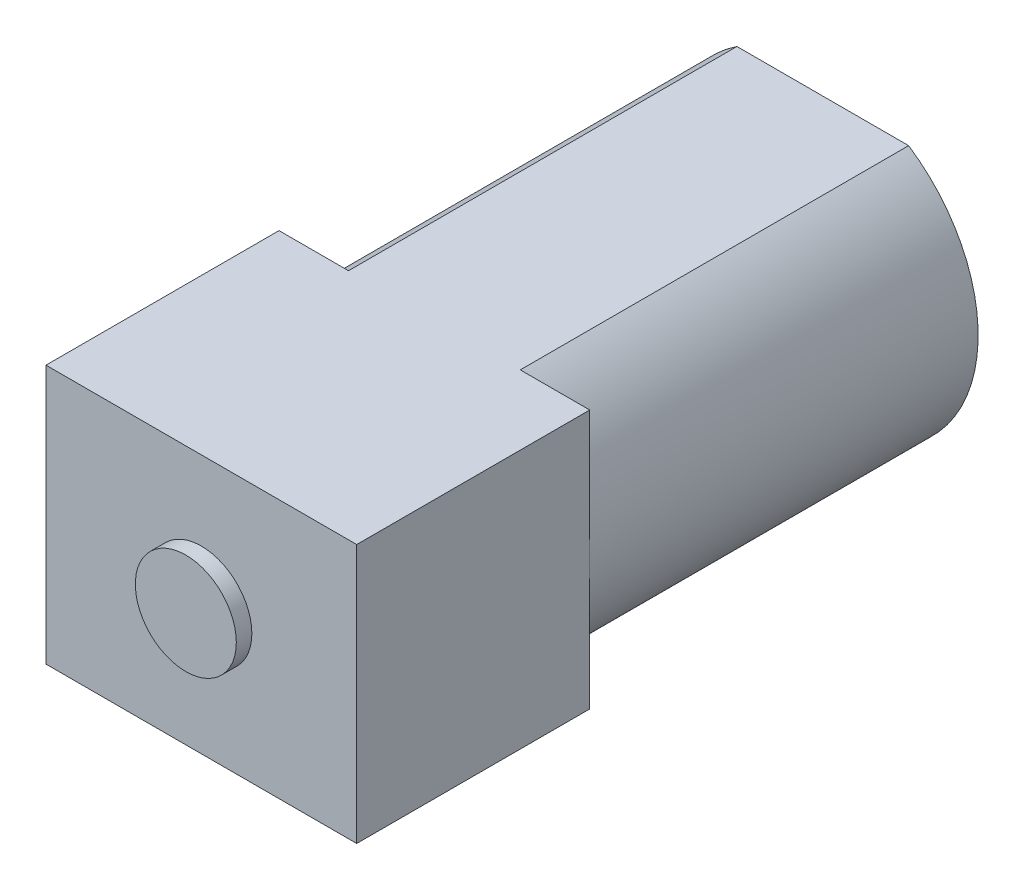
ISO-10303-21;
HEADER;
FILE_DESCRIPTION(('STEP AP214'),'2;1');
FILE_NAME('part.step','',(''),(''),'','','');
FILE_SCHEMA(('AUTOMOTIVE_DESIGN { 1 0 10303 214 1 1 1 1 }'));
ENDSEC;
DATA;
#1=APPLICATION_CONTEXT('core data for automotive mechanical design processes');
#2=APPLICATION_PROTOCOL_DEFINITION('international standard','automotive_design',2000,#1);
#3=PRODUCT_CONTEXT('',#1,'mechanical');
#4=PRODUCT('Part','Part','',(#3));
#5=PRODUCT_RELATED_PRODUCT_CATEGORY('part','',(#4));
#6=PRODUCT_DEFINITION_FORMATION('','',#4);
#7=PRODUCT_DEFINITION_CONTEXT('part definition',#1,'design');
#8=PRODUCT_DEFINITION('design','',#6,#7);
#9=PRODUCT_DEFINITION_SHAPE('','',#8);
#10=(LENGTH_UNIT() NAMED_UNIT(*) SI_UNIT(.MILLI.,.METRE.));
#11=(NAMED_UNIT(*) PLANE_ANGLE_UNIT() SI_UNIT($,.RADIAN.));
#12=(NAMED_UNIT(*) SI_UNIT($,.STERADIAN.) SOLID_ANGLE_UNIT());
#13=UNCERTAINTY_MEASURE_WITH_UNIT(LENGTH_MEASURE(1.E-05),#10,'distance_accuracy_value','');
#14=(GEOMETRIC_REPRESENTATION_CONTEXT(3) GLOBAL_UNCERTAINTY_ASSIGNED_CONTEXT((#13)) GLOBAL_UNIT_ASSIGNED_CONTEXT((#10,
#11,#12)) REPRESENTATION_CONTEXT('',''));
#15=CARTESIAN_POINT('',(0.,0.,0.));
#16=DIRECTION('',(0.,0.,1.));
#17=DIRECTION('',(1.,0.,0.));
#18=AXIS2_PLACEMENT_3D('',#15,#16,#17);
#19=CARTESIAN_POINT('',(-6.,-5.,9.));
#20=DIRECTION('',(0.,0.,1.));
#21=DIRECTION('',(1.,0.,0.));
#22=AXIS2_PLACEMENT_3D('',#19,#20,#21);
#23=PLANE('',#22);
#24=DIRECTION('',(0.,-1.,0.));
#25=VECTOR('',#24,1.);
#26=CARTESIAN_POINT('',(-6.,5.,9.));
#27=LINE('',#26,#25);
#28=CARTESIAN_POINT('',(-6.,5.,9.));
#29=VERTEX_POINT('',#28);
#30=CARTESIAN_POINT('',(-6.,-5.,9.));
#31=VERTEX_POINT('',#30);
#32=EDGE_CURVE('E143',#29,#31,#27,.T.);
#33=ORIENTED_EDGE('',*,*,#32,.T.);
#34=DIRECTION('',(1.,0.,0.));
#35=VECTOR('',#34,1.);
#36=CARTESIAN_POINT('',(-6.,-5.,9.));
#37=LINE('',#36,#35);
#38=CARTESIAN_POINT('',(6.,-5.,9.));
#39=VERTEX_POINT('',#38);
#40=EDGE_CURVE('E149',#31,#39,#37,.T.);
#41=ORIENTED_EDGE('',*,*,#40,.T.);
#42=DIRECTION('',(0.,1.,0.));
#43=VECTOR('',#42,1.);
#44=CARTESIAN_POINT('',(6.,5.,9.));
#45=LINE('',#44,#43);
#46=CARTESIAN_POINT('',(6.,5.,9.));
#47=VERTEX_POINT('',#46);
#48=EDGE_CURVE('E152',#39,#47,#45,.T.);
#49=ORIENTED_EDGE('',*,*,#48,.T.);
#50=DIRECTION('',(-1.,0.,0.));
#51=VECTOR('',#50,1.);
#52=CARTESIAN_POINT('',(-6.,5.,9.));
#53=LINE('',#52,#51);
#54=EDGE_CURVE('E155',#47,#29,#53,.T.);
#55=ORIENTED_EDGE('',*,*,#54,.T.);
#56=EDGE_LOOP('',(#33,#41,#49,#55));
#57=FACE_BOUND('',#56,.T.);
#58=CARTESIAN_POINT('',(0.,0.,9.));
#59=DIRECTION('',(0.,0.,1.));
#60=DIRECTION('',(1.,0.,0.));
#61=AXIS2_PLACEMENT_3D('',#58,#59,#60);
#62=CIRCLE('',#61,1.95);
#63=CARTESIAN_POINT('',(1.95,0.,9.));
#64=VERTEX_POINT('',#63);
#65=EDGE_CURVE('E202',#64,#64,#62,.T.);
#66=ORIENTED_EDGE('',*,*,#65,.F.);
#67=EDGE_LOOP('',(#66));
#68=FACE_BOUND('',#67,.T.);
#69=ADVANCED_FACE('F41',(#57,#68),#23,.T.);
#70=CARTESIAN_POINT('',(-6.,-5.,-15.));
#71=DIRECTION('',(0.,0.,1.));
#72=DIRECTION('',(1.,0.,0.));
#73=AXIS2_PLACEMENT_3D('',#70,#71,#72);
#74=PLANE('',#73);
#75=CARTESIAN_POINT('',(0.,0.,-15.));
#76=DIRECTION('',(0.,0.,1.));
#77=DIRECTION('',(1.,0.,0.));
#78=AXIS2_PLACEMENT_3D('',#75,#76,#77);
#79=CIRCLE('',#78,6.);
#80=CARTESIAN_POINT('',(-3.3166247903554,5.,-15.));
#81=VERTEX_POINT('',#80);
#82=CARTESIAN_POINT('',(-3.3166247903554,-5.,-15.));
#83=VERTEX_POINT('',#82);
#84=EDGE_CURVE('E171',#81,#83,#79,.T.);
#85=ORIENTED_EDGE('',*,*,#84,.F.);
#86=DIRECTION('',(-1.,0.,0.));
#87=VECTOR('',#86,1.);
#88=CARTESIAN_POINT('',(-6.,5.,-15.));
#89=LINE('',#88,#87);
#90=CARTESIAN_POINT('',(3.3166247903554,5.,-15.));
#91=VERTEX_POINT('',#90);
#92=EDGE_CURVE('E160',#91,#81,#89,.T.);
#93=ORIENTED_EDGE('',*,*,#92,.F.);
#94=CARTESIAN_POINT('',(3.3166247903554,-5.,-15.));
#95=VERTEX_POINT('',#94);
#96=EDGE_CURVE('E165',#95,#91,#79,.T.);
#97=ORIENTED_EDGE('',*,*,#96,.F.);
#98=DIRECTION('',(1.,0.,0.));
#99=VECTOR('',#98,1.);
#100=CARTESIAN_POINT('',(-6.,-5.,-15.));
#101=LINE('',#100,#99);
#102=EDGE_CURVE('E157',#83,#95,#101,.T.);
#103=ORIENTED_EDGE('',*,*,#102,.F.);
#104=EDGE_LOOP('',(#85,#93,#97,#103));
#105=FACE_BOUND('',#104,.T.);
#106=CARTESIAN_POINT('',(0.,0.,-15.));
#107=DIRECTION('',(0.,0.,1.));
#108=DIRECTION('',(1.,0.,0.));
#109=AXIS2_PLACEMENT_3D('',#106,#107,#108);
#110=CIRCLE('',#109,2.5);
#111=CARTESIAN_POINT('',(2.5,0.,-15.));
#112=VERTEX_POINT('',#111);
#113=EDGE_CURVE('E12',#112,#112,#110,.F.);
#114=ORIENTED_EDGE('',*,*,#113,.F.);
#115=EDGE_LOOP('',(#114));
#116=FACE_BOUND('',#115,.T.);
#117=ADVANCED_FACE('F182',(#105,#116),#74,.F.);
#118=CARTESIAN_POINT('',(-6.,5.,-15.));
#119=DIRECTION('',(-1.,0.,0.));
#120=DIRECTION('',(0.,-1.,0.));
#121=AXIS2_PLACEMENT_3D('',#118,#119,#120);
#122=PLANE('',#121);
#123=DIRECTION('',(0.,0.,1.));
#124=VECTOR('',#123,1.);
#125=CARTESIAN_POINT('',(-6.,5.,-15.));
#126=LINE('',#125,#124);
#127=CARTESIAN_POINT('',(-6.,5.,0.));
#128=VERTEX_POINT('',#127);
#129=EDGE_CURVE('E64',#128,#29,#126,.T.);
#130=ORIENTED_EDGE('',*,*,#129,.F.);
#131=DIRECTION('',(0.,-1.,0.));
#132=VECTOR('',#131,1.);
#133=CARTESIAN_POINT('',(-6.,5.,0.));
#134=LINE('',#133,#132);
#135=CARTESIAN_POINT('',(-6.,0.,0.));
#136=VERTEX_POINT('',#135);
#137=EDGE_CURVE('E123',#128,#136,#134,.T.);
#138=ORIENTED_EDGE('',*,*,#137,.T.);
#139=CARTESIAN_POINT('',(-6.,-5.,0.));
#140=VERTEX_POINT('',#139);
#141=EDGE_CURVE('E115',#136,#140,#134,.T.);
#142=ORIENTED_EDGE('',*,*,#141,.T.);
#143=DIRECTION('',(0.,0.,1.));
#144=VECTOR('',#143,1.);
#145=CARTESIAN_POINT('',(-6.,-5.,-15.));
#146=LINE('',#145,#144);
#147=EDGE_CURVE('E163',#140,#31,#146,.T.);
#148=ORIENTED_EDGE('',*,*,#147,.T.);
#149=ORIENTED_EDGE('',*,*,#32,.F.);
#150=EDGE_LOOP('',(#130,#138,#142,#148,#149));
#151=FACE_BOUND('',#150,.T.);
#152=ADVANCED_FACE('F43',(#151),#122,.T.);
#153=CARTESIAN_POINT('',(-6.,5.,-15.));
#154=DIRECTION('',(0.,1.,0.));
#155=DIRECTION('',(0.,0.,1.));
#156=AXIS2_PLACEMENT_3D('',#153,#154,#155);
#157=PLANE('',#156);
#158=DIRECTION('',(0.,0.,1.));
#159=VECTOR('',#158,1.);
#160=CARTESIAN_POINT('',(6.,5.,-15.));
#161=LINE('',#160,#159);
#162=CARTESIAN_POINT('',(6.,5.,0.));
#163=VERTEX_POINT('',#162);
#164=EDGE_CURVE('E166',#163,#47,#161,.T.);
#165=ORIENTED_EDGE('',*,*,#164,.F.);
#166=DIRECTION('',(-1.,0.,0.));
#167=VECTOR('',#166,1.);
#168=CARTESIAN_POINT('',(-6.,5.,0.));
#169=LINE('',#168,#167);
#170=CARTESIAN_POINT('',(3.3166247903554,5.,0.));
#171=VERTEX_POINT('',#170);
#172=EDGE_CURVE('E124',#163,#171,#169,.T.);
#173=ORIENTED_EDGE('',*,*,#172,.T.);
#174=DIRECTION('',(0.,0.,-1.));
#175=VECTOR('',#174,1.);
#176=CARTESIAN_POINT('',(3.3166247903554,5.,0.));
#177=LINE('',#176,#175);
#178=EDGE_CURVE('E187',#171,#91,#177,.T.);
#179=ORIENTED_EDGE('',*,*,#178,.T.);
#180=ORIENTED_EDGE('',*,*,#92,.T.);
#181=DIRECTION('',(0.,0.,-1.));
#182=VECTOR('',#181,1.);
#183=CARTESIAN_POINT('',(-3.3166247903554,5.,0.));
#184=LINE('',#183,#182);
#185=CARTESIAN_POINT('',(-3.3166247903554,5.,0.));
#186=VERTEX_POINT('',#185);
#187=EDGE_CURVE('E176',#81,#186,#184,.F.);
#188=ORIENTED_EDGE('',*,*,#187,.T.);
#189=EDGE_CURVE('E140',#186,#128,#169,.T.);
#190=ORIENTED_EDGE('',*,*,#189,.T.);
#191=ORIENTED_EDGE('',*,*,#129,.T.);
#192=ORIENTED_EDGE('',*,*,#54,.F.);
#193=EDGE_LOOP('',(#165,#173,#179,#180,#188,#190,#191,#192));
#194=FACE_BOUND('',#193,.T.);
#195=ADVANCED_FACE('F191',(#194),#157,.T.);
#196=CARTESIAN_POINT('',(6.,5.,-15.));
#197=DIRECTION('',(1.,0.,0.));
#198=DIRECTION('',(0.,1.,0.));
#199=AXIS2_PLACEMENT_3D('',#196,#197,#198);
#200=PLANE('',#199);
#201=DIRECTION('',(0.,0.,1.));
#202=VECTOR('',#201,1.);
#203=CARTESIAN_POINT('',(6.,-5.,-15.));
#204=LINE('',#203,#202);
#205=CARTESIAN_POINT('',(6.,-5.,0.));
#206=VERTEX_POINT('',#205);
#207=EDGE_CURVE('E168',#206,#39,#204,.T.);
#208=ORIENTED_EDGE('',*,*,#207,.F.);
#209=DIRECTION('',(0.,1.,0.));
#210=VECTOR('',#209,1.);
#211=CARTESIAN_POINT('',(6.,5.,0.));
#212=LINE('',#211,#210);
#213=CARTESIAN_POINT('',(6.,0.,0.));
#214=VERTEX_POINT('',#213);
#215=EDGE_CURVE('E192',#206,#214,#212,.T.);
#216=ORIENTED_EDGE('',*,*,#215,.T.);
#217=EDGE_CURVE('E195',#214,#163,#212,.T.);
#218=ORIENTED_EDGE('',*,*,#217,.T.);
#219=ORIENTED_EDGE('',*,*,#164,.T.);
#220=ORIENTED_EDGE('',*,*,#48,.F.);
#221=EDGE_LOOP('',(#208,#216,#218,#219,#220));
#222=FACE_BOUND('',#221,.T.);
#223=ADVANCED_FACE('F230',(#222),#200,.T.);
#224=CARTESIAN_POINT('',(-6.,-5.,-15.));
#225=DIRECTION('',(0.,-1.,0.));
#226=DIRECTION('',(0.,0.,-1.));
#227=AXIS2_PLACEMENT_3D('',#224,#225,#226);
#228=PLANE('',#227);
#229=ORIENTED_EDGE('',*,*,#147,.F.);
#230=DIRECTION('',(1.,0.,0.));
#231=VECTOR('',#230,1.);
#232=CARTESIAN_POINT('',(-6.,-5.,0.));
#233=LINE('',#232,#231);
#234=CARTESIAN_POINT('',(-3.3166247903554,-5.,0.));
#235=VERTEX_POINT('',#234);
#236=EDGE_CURVE('E49',#140,#235,#233,.T.);
#237=ORIENTED_EDGE('',*,*,#236,.T.);
#238=DIRECTION('',(0.,0.,-1.));
#239=VECTOR('',#238,1.);
#240=CARTESIAN_POINT('',(-3.3166247903554,-5.,0.));
#241=LINE('',#240,#239);
#242=EDGE_CURVE('E134',#235,#83,#241,.T.);
#243=ORIENTED_EDGE('',*,*,#242,.T.);
#244=ORIENTED_EDGE('',*,*,#102,.T.);
#245=DIRECTION('',(0.,0.,-1.));
#246=VECTOR('',#245,1.);
#247=CARTESIAN_POINT('',(3.3166247903554,-5.,0.));
#248=LINE('',#247,#246);
#249=CARTESIAN_POINT('',(3.3166247903554,-5.,0.));
#250=VERTEX_POINT('',#249);
#251=EDGE_CURVE('E56',#95,#250,#248,.F.);
#252=ORIENTED_EDGE('',*,*,#251,.T.);
#253=EDGE_CURVE('E172',#250,#206,#233,.T.);
#254=ORIENTED_EDGE('',*,*,#253,.T.);
#255=ORIENTED_EDGE('',*,*,#207,.T.);
#256=ORIENTED_EDGE('',*,*,#40,.F.);
#257=EDGE_LOOP('',(#229,#237,#243,#244,#252,#254,#255,#256));
#258=FACE_BOUND('',#257,.T.);
#259=ADVANCED_FACE('F180',(#258),#228,.T.);
#260=CARTESIAN_POINT('',(0.,0.,0.));
#261=DIRECTION('',(0.,0.,-1.));
#262=DIRECTION('',(-1.,0.,0.));
#263=AXIS2_PLACEMENT_3D('',#260,#261,#262);
#264=CYLINDRICAL_SURFACE('',#263,6.);
#265=CARTESIAN_POINT('',(0.,0.,0.));
#266=DIRECTION('',(0.,0.,-1.));
#267=DIRECTION('',(-1.,0.,0.));
#268=AXIS2_PLACEMENT_3D('',#265,#266,#267);
#269=CIRCLE('',#268,6.);
#270=EDGE_CURVE('E141',#171,#214,#269,.T.);
#271=ORIENTED_EDGE('',*,*,#270,.T.);
#272=EDGE_CURVE('E135',#214,#250,#269,.T.);
#273=ORIENTED_EDGE('',*,*,#272,.T.);
#274=ORIENTED_EDGE('',*,*,#251,.F.);
#275=ORIENTED_EDGE('',*,*,#96,.T.);
#276=ORIENTED_EDGE('',*,*,#178,.F.);
#277=EDGE_LOOP('',(#271,#273,#274,#275,#276));
#278=FACE_BOUND('',#277,.T.);
#279=ADVANCED_FACE('F186',(#278),#264,.T.);
#280=CARTESIAN_POINT('',(0.,0.,0.));
#281=DIRECTION('',(0.,0.,-1.));
#282=DIRECTION('',(-1.,0.,0.));
#283=AXIS2_PLACEMENT_3D('',#280,#281,#282);
#284=PLANE('',#283);
#285=ORIENTED_EDGE('',*,*,#253,.F.);
#286=ORIENTED_EDGE('',*,*,#272,.F.);
#287=ORIENTED_EDGE('',*,*,#215,.F.);
#288=EDGE_LOOP('',(#285,#286,#287));
#289=FACE_BOUND('',#288,.T.);
#290=ADVANCED_FACE('F225',(#289),#284,.T.);
#291=ORIENTED_EDGE('',*,*,#217,.F.);
#292=ORIENTED_EDGE('',*,*,#270,.F.);
#293=ORIENTED_EDGE('',*,*,#172,.F.);
#294=EDGE_LOOP('',(#291,#292,#293));
#295=FACE_BOUND('',#294,.T.);
#296=ADVANCED_FACE('F240',(#295),#284,.T.);
#297=EDGE_CURVE('E131',#136,#186,#269,.T.);
#298=ORIENTED_EDGE('',*,*,#297,.F.);
#299=ORIENTED_EDGE('',*,*,#137,.F.);
#300=ORIENTED_EDGE('',*,*,#189,.F.);
#301=EDGE_LOOP('',(#298,#299,#300));
#302=FACE_BOUND('',#301,.T.);
#303=ADVANCED_FACE('F139',(#302),#284,.T.);
#304=EDGE_CURVE('E118',#235,#136,#269,.T.);
#305=ORIENTED_EDGE('',*,*,#304,.F.);
#306=ORIENTED_EDGE('',*,*,#236,.F.);
#307=ORIENTED_EDGE('',*,*,#141,.F.);
#308=EDGE_LOOP('',(#305,#306,#307));
#309=FACE_BOUND('',#308,.T.);
#310=ADVANCED_FACE('F117',(#309),#284,.T.);
#311=ORIENTED_EDGE('',*,*,#304,.T.);
#312=ORIENTED_EDGE('',*,*,#297,.T.);
#313=ORIENTED_EDGE('',*,*,#187,.F.);
#314=ORIENTED_EDGE('',*,*,#84,.T.);
#315=ORIENTED_EDGE('',*,*,#242,.F.);
#316=EDGE_LOOP('',(#311,#312,#313,#314,#315));
#317=FACE_BOUND('',#316,.T.);
#318=ADVANCED_FACE('F129',(#317),#264,.T.);
#319=CARTESIAN_POINT('',(0.,0.,-16.));
#320=DIRECTION('',(0.,0.,1.));
#321=DIRECTION('',(1.,0.,0.));
#322=AXIS2_PLACEMENT_3D('',#319,#320,#321);
#323=CYLINDRICAL_SURFACE('',#322,2.5);
#324=CARTESIAN_POINT('',(0.,0.,-16.));
#325=DIRECTION('',(0.,0.,-1.));
#326=DIRECTION('',(-1.,0.,0.));
#327=AXIS2_PLACEMENT_3D('',#324,#325,#326);
#328=CIRCLE('',#327,2.5);
#329=CARTESIAN_POINT('',(-2.5,0.,-16.));
#330=VERTEX_POINT('',#329);
#331=EDGE_CURVE('E136',#330,#330,#328,.T.);
#332=ORIENTED_EDGE('',*,*,#331,.F.);
#333=EDGE_LOOP('',(#332));
#334=FACE_BOUND('',#333,.T.);
#335=ORIENTED_EDGE('',*,*,#113,.T.);
#336=EDGE_LOOP('',(#335));
#337=FACE_BOUND('',#336,.T.);
#338=ADVANCED_FACE('F244',(#334,#337),#323,.T.);
#339=CARTESIAN_POINT('',(0.,0.,-16.));
#340=DIRECTION('',(0.,0.,-1.));
#341=DIRECTION('',(-1.,0.,0.));
#342=AXIS2_PLACEMENT_3D('',#339,#340,#341);
#343=PLANE('',#342);
#344=ORIENTED_EDGE('',*,*,#331,.T.);
#345=EDGE_LOOP('',(#344));
#346=FACE_BOUND('',#345,.T.);
#347=ADVANCED_FACE('F213',(#346),#343,.T.);
#348=CARTESIAN_POINT('',(0.,0.,9.6));
#349=DIRECTION('',(0.,0.,-1.));
#350=DIRECTION('',(-1.,0.,0.));
#351=AXIS2_PLACEMENT_3D('',#348,#349,#350);
#352=CYLINDRICAL_SURFACE('',#351,1.95);
#353=CARTESIAN_POINT('',(0.,0.,9.6));
#354=DIRECTION('',(0.,0.,1.));
#355=DIRECTION('',(1.,0.,0.));
#356=AXIS2_PLACEMENT_3D('',#353,#354,#355);
#357=CIRCLE('',#356,1.95);
#358=CARTESIAN_POINT('',(1.95,0.,9.6));
#359=VERTEX_POINT('',#358);
#360=EDGE_CURVE('E201',#359,#359,#357,.T.);
#361=ORIENTED_EDGE('',*,*,#360,.F.);
#362=EDGE_LOOP('',(#361));
#363=FACE_BOUND('',#362,.T.);
#364=ORIENTED_EDGE('',*,*,#65,.T.);
#365=EDGE_LOOP('',(#364));
#366=FACE_BOUND('',#365,.T.);
#367=ADVANCED_FACE('F210',(#363,#366),#352,.T.);
#368=CARTESIAN_POINT('',(0.,0.,9.6));
#369=DIRECTION('',(0.,0.,1.));
#370=DIRECTION('',(1.,0.,0.));
#371=AXIS2_PLACEMENT_3D('',#368,#369,#370);
#372=PLANE('',#371);
#373=ORIENTED_EDGE('',*,*,#360,.T.);
#374=EDGE_LOOP('',(#373));
#375=FACE_BOUND('',#374,.T.);
#376=ADVANCED_FACE('F208',(#375),#372,.T.);
#377=CLOSED_SHELL('',(#69,#117,#152,#195,#223,#259,#279,#290,#296,#303,#310,#318,#338,#347,#367,#376));
#378=MANIFOLD_SOLID_BREP('B2',#377);
#379=ADVANCED_BREP_SHAPE_REPRESENTATION('',(#18,#378),#14);
#380=SHAPE_DEFINITION_REPRESENTATION(#9,#379);
ENDSEC;
END-ISO-10303-21;
